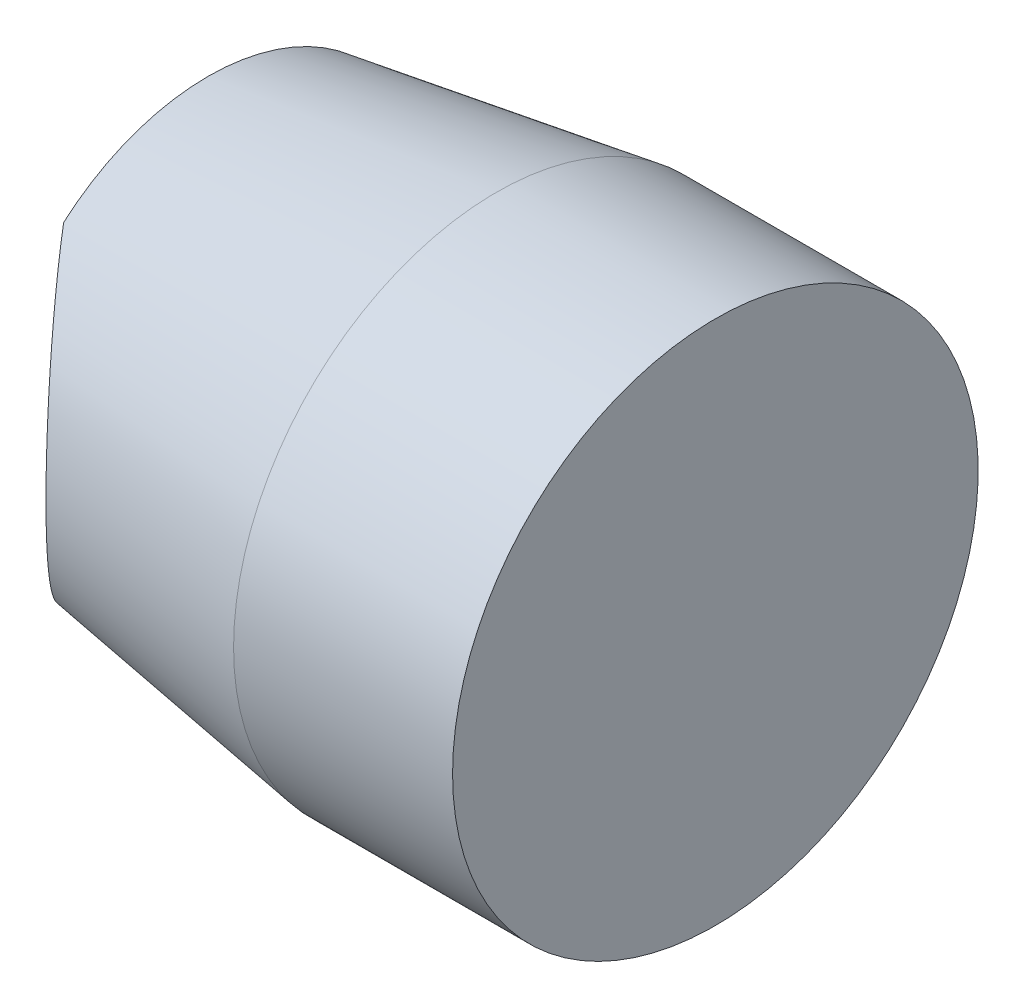
ISO-10303-21;
HEADER;
FILE_DESCRIPTION(('STEP AP214'),'2;1');
FILE_NAME('part.step','',(''),(''),'','','');
FILE_SCHEMA(('AUTOMOTIVE_DESIGN { 1 0 10303 214 1 1 1 1 }'));
ENDSEC;
DATA;
#1=APPLICATION_CONTEXT('core data for automotive mechanical design processes');
#2=APPLICATION_PROTOCOL_DEFINITION('international standard','automotive_design',2000,#1);
#3=PRODUCT_CONTEXT('',#1,'mechanical');
#4=PRODUCT('Part','Part','',(#3));
#5=PRODUCT_RELATED_PRODUCT_CATEGORY('part','',(#4));
#6=PRODUCT_DEFINITION_FORMATION('','',#4);
#7=PRODUCT_DEFINITION_CONTEXT('part definition',#1,'design');
#8=PRODUCT_DEFINITION('design','',#6,#7);
#9=PRODUCT_DEFINITION_SHAPE('','',#8);
#10=(LENGTH_UNIT() NAMED_UNIT(*) SI_UNIT(.MILLI.,.METRE.));
#11=(NAMED_UNIT(*) PLANE_ANGLE_UNIT() SI_UNIT($,.RADIAN.));
#12=(NAMED_UNIT(*) SI_UNIT($,.STERADIAN.) SOLID_ANGLE_UNIT());
#13=UNCERTAINTY_MEASURE_WITH_UNIT(LENGTH_MEASURE(1.E-05),#10,'distance_accuracy_value','');
#14=(GEOMETRIC_REPRESENTATION_CONTEXT(3) GLOBAL_UNCERTAINTY_ASSIGNED_CONTEXT((#13)) GLOBAL_UNIT_ASSIGNED_CONTEXT((#10,
#11,#12)) REPRESENTATION_CONTEXT('',''));
#15=CARTESIAN_POINT('',(0.,0.,0.));
#16=DIRECTION('',(0.,0.,1.));
#17=DIRECTION('',(1.,0.,0.));
#18=AXIS2_PLACEMENT_3D('',#15,#16,#17);
#19=CARTESIAN_POINT('',(0.,3.,0.));
#20=DIRECTION('',(1.,0.,0.));
#21=DIRECTION('',(0.,0.,-1.));
#22=AXIS2_PLACEMENT_3D('',#19,#20,#21);
#23=PLANE('',#22);
#24=CARTESIAN_POINT('',(0.,2.30271578793389,0.));
#25=CARTESIAN_POINT('',(0.,2.30271619018956,-0.256057420989866));
#26=CARTESIAN_POINT('',(0.,2.30041481848519,-0.512115486956815));
#27=CARTESIAN_POINT('',(0.,2.29111924963619,-1.02415480128034));
#28=CARTESIAN_POINT('',(0.,2.28412491334884,-1.28013604713413));
#29=CARTESIAN_POINT('',(0.,2.26515634263327,-1.79209873847997));
#30=CARTESIAN_POINT('',(0.,2.253178571374,-2.04808005473503));
#31=CARTESIAN_POINT('',(0.,2.22375143060397,-2.5597230435989));
#32=CARTESIAN_POINT('',(0.,2.20630226342632,-2.81538472767682));
#33=CARTESIAN_POINT('',(0.,2.16524643190168,-3.32543629194042));
#34=CARTESIAN_POINT('',(0.,2.14165868193388,-3.57982767413026));
#35=CARTESIAN_POINT('',(0.,2.08723238381336,-4.08783054496586));
#36=CARTESIAN_POINT('',(0.,2.05639433168584,-4.34144208576206));
#37=CARTESIAN_POINT('',(0.,1.98596835851503,-4.84715786518813));
#38=CARTESIAN_POINT('',(0.,1.94639075878595,-5.09926352451207));
#39=CARTESIAN_POINT('',(0.,1.85625347124165,-5.60147587977535));
#40=CARTESIAN_POINT('',(0.,1.80569793894974,-5.85158329507749));
#41=CARTESIAN_POINT('',(0.,1.7268048879287,-6.19068734125625));
#42=CARTESIAN_POINT('',(0.,1.70474160874452,-6.28114936187864));
#43=CARTESIAN_POINT('',(0.,1.65842518892863,-6.46151329243922));
#44=CARTESIAN_POINT('',(0.,1.63417190698073,-6.55141516583159));
#45=CARTESIAN_POINT('',(0.,1.55761053823987,-6.82052527713747));
#46=CARTESIAN_POINT('',(0.,1.50159393528638,-6.99872681524354));
#47=CARTESIAN_POINT('',(0.,1.4057193897648,-7.26818101742081));
#48=CARTESIAN_POINT('',(0.,1.37056144158468,-7.36111016036302));
#49=CARTESIAN_POINT('',(0.,1.29578812835875,-7.54514746566464));
#50=CARTESIAN_POINT('',(0.,1.25617413392555,-7.63625617786238));
#51=CARTESIAN_POINT('',(0.,1.17166272957867,-7.81562118473223));
#52=CARTESIAN_POINT('',(0.,1.12678436031493,-7.90388637202995));
#53=CARTESIAN_POINT('',(0.,1.03033462518166,-8.07664019329982));
#54=CARTESIAN_POINT('',(0.,0.978771037054321,-8.16113306485225));
#55=CARTESIAN_POINT('',(0.,0.885941912754167,-8.29664915808889));
#56=CARTESIAN_POINT('',(0.,0.84709792125466,-8.34932127970212));
#57=CARTESIAN_POINT('',(0.,0.764833982254394,-8.45113444955086));
#58=CARTESIAN_POINT('',(0.,0.721408353970244,-8.50027098403376));
#59=CARTESIAN_POINT('',(0.,0.628750007651179,-8.59375005583249));
#60=CARTESIAN_POINT('',(0.,0.57946639964579,-8.63804302692048));
#61=CARTESIAN_POINT('',(0.,0.474646326766768,-8.71854835575752));
#62=CARTESIAN_POINT('',(0.,0.419126230673049,-8.75478115605383));
#63=CARTESIAN_POINT('',(0.,0.321574321522042,-8.80503790469086));
#64=CARTESIAN_POINT('',(0.,0.281295684209852,-8.82243192409152));
#65=CARTESIAN_POINT('',(0.,0.198469720279116,-8.85055246719884));
#66=CARTESIAN_POINT('',(0.,0.155925377250438,-8.86128753498317));
#67=CARTESIAN_POINT('',(0.,0.0692672934627121,-8.8750354301983));
#68=CARTESIAN_POINT('',(0.,0.025144684355504,-8.87799394040268));
#69=CARTESIAN_POINT('',(0.,-0.0628867030327287,-8.8756600309061));
#70=CARTESIAN_POINT('',(0.,-0.106795434737063,-8.8703658880979));
#71=CARTESIAN_POINT('',(0.,-0.189453872023171,-8.85291423995703));
#72=CARTESIAN_POINT('',(0.,-0.228333011571382,-8.84134882624701));
#73=CARTESIAN_POINT('',(0.,-0.304013576985636,-8.81278219020494));
#74=CARTESIAN_POINT('',(0.,-0.340814064186539,-8.79577853483315));
#75=CARTESIAN_POINT('',(0.,-0.435724052160858,-8.74463976172805));
#76=CARTESIAN_POINT('',(0.,-0.49173488368535,-8.70663068469886));
#77=CARTESIAN_POINT('',(0.,-0.597384420222757,-8.62258351253169));
#78=CARTESIAN_POINT('',(0.,-0.647000923525924,-8.57651868587694));
#79=CARTESIAN_POINT('',(0.,-0.738420787686659,-8.48141943838558));
#80=CARTESIAN_POINT('',(0.,-0.780483190798535,-8.43262968793735));
#81=CARTESIAN_POINT('',(0.,-0.860363663787594,-8.33166006153359));
#82=CARTESIAN_POINT('',(0.,-0.898177557763886,-8.27947692834547));
#83=CARTESIAN_POINT('',(0.,-0.970265298966888,-8.1726008019032));
#84=CARTESIAN_POINT('',(0.,-1.00453235369548,-8.11790327231091));
#85=CARTESIAN_POINT('',(0.,-1.06997588681387,-8.0067365508432));
#86=CARTESIAN_POINT('',(0.,-1.1011536514987,-7.9502681093297));
#87=CARTESIAN_POINT('',(0.,-1.17871942577881,-7.80183009848809));
#88=CARTESIAN_POINT('',(0.,-1.22307166246294,-7.70879838397381));
#89=CARTESIAN_POINT('',(0.,-1.30642615604186,-7.52034871378631));
#90=CARTESIAN_POINT('',(0.,-1.3454254822028,-7.42492948447364));
#91=CARTESIAN_POINT('',(0.,-1.41906850582677,-7.23223917262614));
#92=CARTESIAN_POINT('',(0.,-1.45370425192824,-7.13496507099022));
#93=CARTESIAN_POINT('',(0.,-1.51924640991826,-6.93916248548734));
#94=CARTESIAN_POINT('',(0.,-1.55015216135109,-6.84063378287749));
#95=CARTESIAN_POINT('',(0.,-1.63845867239388,-6.54247188284159));
#96=CARTESIAN_POINT('',(0.,-1.69103038798245,-6.341401393893));
#97=CARTESIAN_POINT('',(0.,-1.76252778911013,-6.03826032449602));
#98=CARTESIAN_POINT('',(0.,-1.78512288550943,-5.93701496005578));
#99=CARTESIAN_POINT('',(0.,-1.82813198605774,-5.73406043139156));
#100=CARTESIAN_POINT('',(0.,-1.84854603196845,-5.63235127608693));
#101=CARTESIAN_POINT('',(0.,-1.9068058463016,-5.32703299721612));
#102=CARTESIAN_POINT('',(0.,-1.94175302379137,-5.12286990941627));
#103=CARTESIAN_POINT('',(0.,-2.00530126064684,-4.71354875654689));
#104=CARTESIAN_POINT('',(0.,-2.03390144215257,-4.50839055784738));
#105=CARTESIAN_POINT('',(0.,-2.08575961890146,-4.09729416459807));
#106=CARTESIAN_POINT('',(0.,-2.1090147538267,-3.89135561209155));
#107=CARTESIAN_POINT('',(0.,-2.15089621228305,-3.47902015363704));
#108=CARTESIAN_POINT('',(0.,-2.16952264070898,-3.27262325818288));
#109=CARTESIAN_POINT('',(0.,-2.21940195439557,-2.65200420600774));
#110=CARTESIAN_POINT('',(0.,-2.24454294069056,-2.23728632251772));
#111=CARTESIAN_POINT('',(0.,-2.28142740306044,-1.40725400885803));
#112=CARTESIAN_POINT('',(0.,-2.29316981067247,-0.991939533757277));
#113=CARTESIAN_POINT('',(0.,-2.3016197372805,-0.369267348183715));
#114=CARTESIAN_POINT('',(0.,-2.30291230270835,-0.16196276239538));
#115=CARTESIAN_POINT('',(0.,-2.3024710305298,0.252629882313115));
#116=CARTESIAN_POINT('',(0.,-2.30073738720339,0.459917941439896));
#117=CARTESIAN_POINT('',(0.,-2.29095752287499,1.08179520044146));
#118=CARTESIAN_POINT('',(0.,-2.27833132736208,1.49632166318861));
#119=CARTESIAN_POINT('',(0.,-2.23960090872179,2.32445014572915));
#120=CARTESIAN_POINT('',(0.,-2.21350733620163,2.73805263702833));
#121=CARTESIAN_POINT('',(0.,-2.16202951844811,3.35737616867643));
#122=CARTESIAN_POINT('',(0.,-2.14281682382819,3.56361444597708));
#123=CARTESIAN_POINT('',(0.,-2.09968033832001,3.97559397609276));
#124=CARTESIAN_POINT('',(0.,-2.07575679467123,4.1813352544184));
#125=CARTESIAN_POINT('',(0.,-2.02276922950357,4.58954739533259));
#126=CARTESIAN_POINT('',(0.,-1.99377317972838,4.79202699831362));
#127=CARTESIAN_POINT('',(0.,-1.92943633981791,5.19602664483702));
#128=CARTESIAN_POINT('',(0.,-1.89409445611595,5.39754651683657));
#129=CARTESIAN_POINT('',(0.,-1.81574891109572,5.79876514286587));
#130=CARTESIAN_POINT('',(0.,-1.77275781204449,5.99846632685503));
#131=CARTESIAN_POINT('',(0.,-1.67713009184717,6.39551924105181));
#132=CARTESIAN_POINT('',(0.,-1.62449797852452,6.59287202355924));
#133=CARTESIAN_POINT('',(0.,-1.54492452873739,6.85656335344364));
#134=CARTESIAN_POINT('',(0.,-1.52355197367489,6.92458932954281));
#135=CARTESIAN_POINT('',(0.,-1.47906175081979,7.06007099641875));
#136=CARTESIAN_POINT('',(0.,-1.45594394655084,7.12752664213677));
#137=CARTESIAN_POINT('',(0.,-1.38353872556474,7.32925136467965));
#138=CARTESIAN_POINT('',(0.,-1.33130965598138,7.46250472075917));
#139=CARTESIAN_POINT('',(0.,-1.24198272845094,7.66674464493482));
#140=CARTESIAN_POINT('',(0.,-1.20837736216438,7.73926169412236));
#141=CARTESIAN_POINT('',(0.,-1.13740084310569,7.88241962709404));
#142=CARTESIAN_POINT('',(0.,-1.10003098285226,7.95306114437709));
#143=CARTESIAN_POINT('',(0.,-1.02090992465701,8.09151760217561));
#144=CARTESIAN_POINT('',(0.,-0.979175730560581,8.15934217275296));
#145=CARTESIAN_POINT('',(0.,-0.890251463452173,8.29127566708565));
#146=CARTESIAN_POINT('',(0.,-0.843068018245905,8.35538896515575));
#147=CARTESIAN_POINT('',(0.,-0.755045799269324,8.46215935104652));
#148=CARTESIAN_POINT('',(0.,-0.715737177571885,8.50606740884148));
#149=CARTESIAN_POINT('',(0.,-0.632704545578179,8.58968335996891));
#150=CARTESIAN_POINT('',(0.,-0.588974950121212,8.62938580728426));
#151=CARTESIAN_POINT('',(0.,-0.495998697363988,8.70312099761332));
#152=CARTESIAN_POINT('',(0.,-0.446691541306113,8.73707910899359));
#153=CARTESIAN_POINT('',(0.,-0.342876817664349,8.79581530258852));
#154=CARTESIAN_POINT('',(0.,-0.288386761369271,8.82062300584898));
#155=CARTESIAN_POINT('',(0.,-0.192503788108303,8.85208446454662));
#156=CARTESIAN_POINT('',(0.,-0.152176340718685,8.86196610505212));
#157=CARTESIAN_POINT('',(0.,-0.0704317051299258,8.87476414709608));
#158=CARTESIAN_POINT('',(0.,-0.0290155178170578,8.87768673432845));
#159=CARTESIAN_POINT('',(0.,0.0537229626135532,8.87625323091297));
#160=CARTESIAN_POINT('',(0.,0.0950451431318834,8.87189082477117));
#161=CARTESIAN_POINT('',(0.,0.17638670554275,8.85634801479037));
#162=CARTESIAN_POINT('',(0.,0.216404816540665,8.84516115779466));
#163=CARTESIAN_POINT('',(0.,0.30689333045181,8.81241333859658));
#164=CARTESIAN_POINT('',(0.,0.356565965688615,8.78866889766332));
#165=CARTESIAN_POINT('',(0.,0.451507184584574,8.73362017494527));
#166=CARTESIAN_POINT('',(0.,0.496765469772759,8.70229878174129));
#167=CARTESIAN_POINT('',(0.,0.612713048969769,8.61090392671316));
#168=CARTESIAN_POINT('',(0.,0.679454832489103,8.54588313607115));
#169=CARTESIAN_POINT('',(0.,0.803085416460741,8.40717256810155));
#170=CARTESIAN_POINT('',(0.,0.859945900699665,8.33345886126733));
#171=CARTESIAN_POINT('',(0.,0.98631503516413,8.15146856801582));
#172=CARTESIAN_POINT('',(0.,1.0523081650411,8.04078083721444));
#173=CARTESIAN_POINT('',(0.,1.17368742348289,7.81365213824607));
#174=CARTESIAN_POINT('',(0.,1.22905109381456,7.69719962865867));
#175=CARTESIAN_POINT('',(0.,1.33189585938514,7.46015331640255));
#176=CARTESIAN_POINT('',(0.,1.37933253052256,7.3395404637223));
#177=CARTESIAN_POINT('',(0.,1.46764168179653,7.09611113719619));
#178=CARTESIAN_POINT('',(0.,1.50852068731415,6.97329699084475));
#179=CARTESIAN_POINT('',(0.,1.61487822130925,6.62957748985516));
#180=CARTESIAN_POINT('',(0.,1.67465938159899,6.40691503845951));
#181=CARTESIAN_POINT('',(0.,1.78206037868896,5.95863520057769));
#182=CARTESIAN_POINT('',(0.,1.82967262547771,5.73301606171055));
#183=CARTESIAN_POINT('',(0.,1.9154973103287,5.27952684179919));
#184=CARTESIAN_POINT('',(0.,1.95368975838205,5.0516530232704));
#185=CARTESIAN_POINT('',(0.,2.02240235756378,4.59474688328533));
#186=CARTESIAN_POINT('',(0.,2.05292167010774,4.3657144379925));
#187=CARTESIAN_POINT('',(0.,2.10755735583778,3.90705654637218));
#188=CARTESIAN_POINT('',(0.,2.13167812178194,3.67743161672352));
#189=CARTESIAN_POINT('',(0.,2.17447442712944,3.21766783595543));
#190=CARTESIAN_POINT('',(0.,2.19314964706602,2.98752895548248));
#191=CARTESIAN_POINT('',(0.,2.22570457347171,2.52718464100216));
#192=CARTESIAN_POINT('',(0.,2.23958982124239,2.29697959433125));
#193=CARTESIAN_POINT('',(0.,2.26306850731441,1.83635170891861));
#194=CARTESIAN_POINT('',(0.,2.27266191776965,1.60592886877352));
#195=CARTESIAN_POINT('',(0.,2.28782899789987,1.14629951757147));
#196=CARTESIAN_POINT('',(0.,2.29342581672636,0.917093762259857));
#197=CARTESIAN_POINT('',(0.,2.30086927779234,0.458592182283086));
#198=CARTESIAN_POINT('',(0.,2.30271542771876,0.229296349744708));
#199=CARTESIAN_POINT('',(0.,2.30271578793389,0.));
#200=B_SPLINE_CURVE_WITH_KNOTS('',3,(#24,#25,#26,#27,#28,#29,#30,#31,#32,#33,#34,#35,#36,#37,
#38,#39,#40,#41,#42,#43,#44,#45,#46,#47,#48,#49,#50,#51,#52,#53,#54,#55,#56,#57,#58,#59,#60,#61,
#62,#63,#64,#65,#66,#67,#68,#69,#70,#71,#72,#73,#74,#75,#76,#77,#78,#79,#80,#81,#82,#83,#84,#85,
#86,#87,#88,#89,#90,#91,#92,#93,#94,#95,#96,#97,#98,#99,#100,#101,#102,#103,#104,#105,#106,#107,
#108,#109,#110,#111,#112,#113,#114,#115,#116,#117,#118,#119,#120,#121,#122,#123,#124,#125,#126,
#127,#128,#129,#130,#131,#132,#133,#134,#135,#136,#137,#138,#139,#140,#141,#142,#143,#144,#145,
#146,#147,#148,#149,#150,#151,#152,#153,#154,#155,#156,#157,#158,#159,#160,#161,#162,#163,#164,
#165,#166,#167,#168,#169,#170,#171,#172,#173,#174,#175,#176,#177,#178,#179,#180,#181,#182,#183,
#184,#185,#186,#187,#188,#189,#190,#191,#192,#193,#194,#195,#196,#197,#198,#199),.UNSPECIFIED.,
.T.,.F.,(4,2,2,2,2,2,2,2,2,2,2,2,2,2,2,2,2,2,2,2,2,2,2,2,2,2,2,2,2,2,2,2,2,2,2,2,2,2,2,2,2,2,2,
2,2,2,2,2,2,2,2,2,2,2,2,2,2,2,2,2,2,2,2,2,2,2,2,2,2,2,2,2,2,2,2,2,2,2,2,2,2,2,2,2,2,2,2,4),(0.,
0.768162777638334,1.53634833170923,2.30508001304346,3.07378326990723,3.84014545581212,
4.60645522674255,5.37186478846892,6.13698511997906,6.4163009921842,6.69563490094226,
7.25556624394516,7.55355368307463,7.8514497151043,8.14829971355869,8.44480739786877,
8.64095731216252,8.83735335688242,9.03560105147041,9.23334005928364,9.36449587532189,
9.49548305578821,9.62738274585719,9.75930997952392,9.88052677215571,10.0017978725623,
10.2036926061374,10.4062704626149,10.599234673315,10.792386921108,10.985902481908,
11.1793371265712,11.4882896127895,11.7974105823384,12.1070869294942,12.4168180296452,
13.039911535577,13.3511073739033,13.6622972525352,14.2835598033516,14.904908228193,
15.5265883877439,16.1482544576183,17.3944024325485,18.6406497739719,19.2625564398833,
19.8844231813889,21.1283840527891,22.3713626480266,22.9927138206122,23.6140323915134,
24.2275868929556,24.8412472288481,25.4539089026205,26.066284843631,26.2801765866915,
26.4940850731836,26.9230689947348,27.162762966432,27.4023749191951,27.6410858438768,
27.8795094281005,28.0560719580124,28.2328604006605,28.411793724899,28.5901426270652,
28.7141734861787,28.8380940567559,28.9621221121203,29.0862676297962,29.2505025419247,
29.4151118747224,29.6930675532079,29.9718070678961,30.3574746211609,30.743948266951,
31.1325199784088,31.5207025999954,32.2118084223996,32.9033442560854,33.5963352281616,
34.2894019031967,34.9819915324139,35.6746217847144,36.3664480560729,37.0582788160413,
37.7460690977029,38.4339496529366),.UNSPECIFIED.);
#201=CARTESIAN_POINT('',(-1.1433992165525E-11,-2.25575357307668,-1.97777041578171));
#202=VERTEX_POINT('',#201);
#203=CARTESIAN_POINT('',(0.,-2.25575357306466,1.97777041581523));
#204=VERTEX_POINT('',#203);
#205=EDGE_CURVE('E70',#202,#204,#200,.T.);
#206=ORIENTED_EDGE('',*,*,#205,.F.);
#207=CARTESIAN_POINT('',(0.,0.,0.));
#208=DIRECTION('',(-1.,0.,0.));
#209=DIRECTION('',(0.,0.,1.));
#210=AXIS2_PLACEMENT_3D('',#207,#208,#209);
#211=CIRCLE('',#210,3.);
#212=EDGE_CURVE('E84',#202,#204,#211,.T.);
#213=ORIENTED_EDGE('',*,*,#212,.T.);
#214=EDGE_LOOP('',(#206,#213));
#215=FACE_BOUND('',#214,.T.);
#216=ADVANCED_FACE('F42',(#215),#23,.F.);
#217=CARTESIAN_POINT('',(0.,2.25575357306555,1.97777041579692));
#218=VERTEX_POINT('',#217);
#219=CARTESIAN_POINT('',(0.,2.25575357306554,-1.97777041579706));
#220=VERTEX_POINT('',#219);
#221=EDGE_CURVE('E63',#218,#220,#200,.T.);
#222=ORIENTED_EDGE('',*,*,#221,.F.);
#223=EDGE_CURVE('E89',#218,#220,#211,.T.);
#224=ORIENTED_EDGE('',*,*,#223,.T.);
#225=EDGE_LOOP('',(#222,#224));
#226=FACE_BOUND('',#225,.T.);
#227=ADVANCED_FACE('F120',(#226),#23,.F.);
#228=CARTESIAN_POINT('',(3.95,0.,0.));
#229=DIRECTION('',(1.,0.,0.));
#230=DIRECTION('',(0.,0.,-1.));
#231=AXIS2_PLACEMENT_3D('',#228,#229,#230);
#232=CONICAL_SURFACE('',#231,3.6,0.150746381120422);
#233=CARTESIAN_POINT('',(3.95,0.,0.));
#234=DIRECTION('',(-1.,0.,0.));
#235=DIRECTION('',(0.,0.,1.));
#236=AXIS2_PLACEMENT_3D('',#233,#234,#235);
#237=CIRCLE('',#236,3.6);
#238=CARTESIAN_POINT('',(3.95,0.,3.6));
#239=VERTEX_POINT('',#238);
#240=EDGE_CURVE('E93',#239,#239,#237,.T.);
#241=ORIENTED_EDGE('',*,*,#240,.T.);
#242=EDGE_LOOP('',(#241));
#243=FACE_BOUND('',#242,.T.);
#244=CARTESIAN_POINT('',(-0.545610889147609,-2.67057044931373,1.17373615089215));
#245=CARTESIAN_POINT('',(-0.502803108813773,-2.64569966593585,1.24641302995476));
#246=CARTESIAN_POINT('',(-0.458722948137358,-2.61850442403317,1.31751277000916));
#247=CARTESIAN_POINT('',(-0.369035883915507,-2.55938889644057,1.45672657748777));
#248=CARTESIAN_POINT('',(-0.323428976447891,-2.52746859861136,1.5248406372408));
#249=CARTESIAN_POINT('',(-0.231357229603584,-2.45856545329473,1.65875957653372));
#250=CARTESIAN_POINT('',(-0.184888501011268,-2.42154588507832,1.7245429069225));
#251=CARTESIAN_POINT('',(-0.0921990777257676,-2.34252543320335,1.85321127113476));
#252=CARTESIAN_POINT('',(-0.0459783917505551,-2.30052437564308,1.91609620366992));
#253=CARTESIAN_POINT('',(0.0958622044928516,-2.16240915564013,2.10635757089889));
#254=CARTESIAN_POINT('',(0.18997682899668,-2.05753139173722,2.22870056617786));
#255=CARTESIAN_POINT('',(0.368249884253227,-1.82448165870408,2.45688291391883));
#256=CARTESIAN_POINT('',(0.452437517429607,-1.69638097696711,2.56277097994706));
#257=CARTESIAN_POINT('',(0.587156270548502,-1.44998452044558,2.73079615572037));
#258=CARTESIAN_POINT('',(0.640942468029903,-1.33650067704264,2.7973620293662));
#259=CARTESIAN_POINT('',(0.736503908371695,-1.0969413283267,2.91516163052352));
#260=CARTESIAN_POINT('',(0.778282591632269,-0.970869443724066,2.96639974992455));
#261=CARTESIAN_POINT('',(0.829876786481205,-0.77390830255137,3.02954303670104));
#262=CARTESIAN_POINT('',(0.845275542620623,-0.706607024436623,3.04836132989053));
#263=CARTESIAN_POINT('',(0.871963837686773,-0.570010271370193,3.0809491564713));
#264=CARTESIAN_POINT('',(0.883255489939714,-0.500715841866394,3.09472128641232));
#265=CARTESIAN_POINT('',(0.901469446075214,-0.360737087188058,3.11692601434145));
#266=CARTESIAN_POINT('',(0.908393685901765,-0.290053392181442,3.12536097814178));
#267=CARTESIAN_POINT('',(0.917722093815138,-0.147973788290901,3.13672258482315));
#268=CARTESIAN_POINT('',(0.920126891824431,-0.0765779800565048,3.13964999535028));
#269=CARTESIAN_POINT('',(0.920413007689851,0.118599076630239,3.1399992014675));
#270=CARTESIAN_POINT('',(0.913694776379617,0.242472090451541,3.13182253747278));
#271=CARTESIAN_POINT('',(0.886924348076632,0.486454040652434,3.09919796974569));
#272=CARTESIAN_POINT('',(0.866873962858767,0.606563486160643,3.07475227689483));
#273=CARTESIAN_POINT('',(0.81520373752643,0.838288434684297,3.01160581410382));
#274=CARTESIAN_POINT('',(0.783761141518193,0.950003996543325,2.97312337425642));
#275=CARTESIAN_POINT('',(0.711011975573178,1.16495478006154,2.88376596576031));
#276=CARTESIAN_POINT('',(0.669696355563081,1.26818210363047,2.83287962625677));
#277=CARTESIAN_POINT('',(0.560071273732403,1.50623977849673,2.69715846501101));
#278=CARTESIAN_POINT('',(0.487705130998386,1.63618675154774,2.60703325881913));
#279=CARTESIAN_POINT('',(0.332049566542625,1.87545195765728,2.4107486343961));
#280=CARTESIAN_POINT('',(0.248761609071415,1.98477295118781,2.30459136524023));
#281=CARTESIAN_POINT('',(0.135812001257767,2.11452034244966,2.15757222126995));
#282=CARTESIAN_POINT('',(0.108925094597979,2.14411136176039,2.12236154811415));
#283=CARTESIAN_POINT('',(0.0546816329969175,2.20142511376235,2.05078477370333));
#284=CARTESIAN_POINT('',(0.0273250443679917,2.22914771173386,2.01441858940951));
#285=CARTESIAN_POINT('',(-0.0573639719746663,2.31160782020116,1.90083421547522));
#286=CARTESIAN_POINT('',(-0.115254509080531,2.36329073265159,1.82179305848447));
#287=CARTESIAN_POINT('',(-0.231197403932565,2.45895944738774,1.65917884427957));
#288=CARTESIAN_POINT('',(-0.289249864242285,2.50293772432165,1.57560145958115));
#289=CARTESIAN_POINT('',(-0.403767855186071,2.58330559544734,1.40399384530779));
#290=CARTESIAN_POINT('',(-0.460235146492306,2.61970392276178,1.31596888693304));
#291=CARTESIAN_POINT('',(-0.569345218412312,2.68505262421899,1.1350131547946));
#292=CARTESIAN_POINT('',(-0.621992734949701,2.71401233835736,1.04208871142006));
#293=CARTESIAN_POINT('',(-0.697864147994482,2.75304572872195,0.893797514835816));
#294=CARTESIAN_POINT('',(-0.723635820828495,2.76574107371353,0.84042827566491));
#295=CARTESIAN_POINT('',(-0.772121696912091,2.78881611331405,0.731854105530617));
#296=CARTESIAN_POINT('',(-0.794836468116664,2.79919623831398,0.676649517947995));
#297=CARTESIAN_POINT('',(-0.815593957363158,2.80838992900986,0.620457917948785));
#298=B_SPLINE_CURVE_WITH_KNOTS('',3,(#244,#245,#246,#247,#248,#249,#250,#251,#252,#253,#254,
#255,#256,#257,#258,#259,#260,#261,#262,#263,#264,#265,#266,#267,#268,#269,#270,#271,#272,#273,
#274,#275,#276,#277,#278,#279,#280,#281,#282,#283,#284,#285,#286,#287,#288,#289,#290,#291,#292,
#293,#294,#295,#296,#297),.UNSPECIFIED.,.F.,.F.,(4,2,2,2,2,2,2,2,2,2,2,2,2,2,2,2,2,2,2,2,2,2,2,
2,2,2,4),(0.,0.26371972289796,0.527440123338272,0.793169931087007,1.05890901808333,
1.61654072030406,2.17248878573669,2.59732979246079,3.02204895185715,3.23645519886422,
3.45075096571203,3.66495167474106,3.87912252613384,4.25006146739332,4.62095001015392,
4.98629988195101,5.35198594382299,5.87091014854623,6.38976485385845,6.54956752645344,
6.70938170908067,7.04128357033203,7.37350782445372,7.70534716758138,8.036767790435,
8.21846657407667,8.40013155237051),.UNSPECIFIED.);
#299=EDGE_CURVE('E11',#204,#218,#298,.T.);
#300=ORIENTED_EDGE('',*,*,#299,.F.);
#301=ORIENTED_EDGE('',*,*,#212,.F.);
#302=CARTESIAN_POINT('',(-0.545610889147609,2.67057044931373,-1.17373615089215));
#303=CARTESIAN_POINT('',(-0.502803108813775,2.64569966593585,-1.24641302995476));
#304=CARTESIAN_POINT('',(-0.45872294813736,2.61850442403317,-1.31751277000916));
#305=CARTESIAN_POINT('',(-0.369035883915509,2.55938889644056,-1.45672657748777));
#306=CARTESIAN_POINT('',(-0.323428976447891,2.52746859861136,-1.5248406372408));
#307=CARTESIAN_POINT('',(-0.23135722960358,2.45856545329472,-1.65875957653372));
#308=CARTESIAN_POINT('',(-0.184888501011263,2.42154588507832,-1.7245429069225));
#309=CARTESIAN_POINT('',(-0.0921990777257619,2.34252543320334,-1.85321127113476));
#310=CARTESIAN_POINT('',(-0.0459783917505506,2.30052437564307,-1.91609620366993));
#311=CARTESIAN_POINT('',(0.0958622044928544,2.16240915564012,-2.10635757089889));
#312=CARTESIAN_POINT('',(0.189976828996686,2.05753139173722,-2.22870056617786));
#313=CARTESIAN_POINT('',(0.368249884253233,1.82448165870408,-2.45688291391883));
#314=CARTESIAN_POINT('',(0.452437517429609,1.6963809769671,-2.56277097994707));
#315=CARTESIAN_POINT('',(0.5871562705485,1.44998452044557,-2.73079615572038));
#316=CARTESIAN_POINT('',(0.6409424680299,1.33650067704263,-2.79736202936621));
#317=CARTESIAN_POINT('',(0.736503908371696,1.0969413283267,-2.91516163052352));
#318=CARTESIAN_POINT('',(0.778282591632273,0.970869443724063,-2.96639974992455));
#319=CARTESIAN_POINT('',(0.829876786481207,0.773908302551366,-3.02954303670104));
#320=CARTESIAN_POINT('',(0.845275542620623,0.70660702443662,-3.04836132989053));
#321=CARTESIAN_POINT('',(0.871963837686769,0.570010271370189,-3.0809491564713));
#322=CARTESIAN_POINT('',(0.883255489939709,0.500715841866389,-3.09472128641232));
#323=CARTESIAN_POINT('',(0.901469446075216,0.360737087188054,-3.11692601434145));
#324=CARTESIAN_POINT('',(0.908393685901775,0.290053392181438,-3.12536097814178));
#325=CARTESIAN_POINT('',(0.917722093815146,0.147973788290897,-3.13672258482316));
#326=CARTESIAN_POINT('',(0.92012689182443,0.0765779800565002,-3.13964999535028));
#327=CARTESIAN_POINT('',(0.920413007689837,-0.118599076630244,-3.1399992014675));
#328=CARTESIAN_POINT('',(0.913694776379611,-0.242472090451546,-3.13182253747278));
#329=CARTESIAN_POINT('',(0.886924348076634,-0.486454040652438,-3.09919796974569));
#330=CARTESIAN_POINT('',(0.866873962858771,-0.606563486160648,-3.07475227689483));
#331=CARTESIAN_POINT('',(0.815203737526433,-0.838288434684301,-3.01160581410382));
#332=CARTESIAN_POINT('',(0.783761141518195,-0.950003996543328,-2.97312337425642));
#333=CARTESIAN_POINT('',(0.711011975573178,-1.16495478006155,-2.8837659657603));
#334=CARTESIAN_POINT('',(0.669696355563079,-1.26818210363047,-2.83287962625677));
#335=CARTESIAN_POINT('',(0.560071273732401,-1.50623977849673,-2.697158465011));
#336=CARTESIAN_POINT('',(0.487705130998386,-1.63618675154774,-2.60703325881912));
#337=CARTESIAN_POINT('',(0.332049566542626,-1.87545195765729,-2.4107486343961));
#338=CARTESIAN_POINT('',(0.248761609071412,-1.98477295118781,-2.30459136524023));
#339=CARTESIAN_POINT('',(0.135812001257767,-2.11452034244966,-2.15757222126995));
#340=CARTESIAN_POINT('',(0.108925094597981,-2.14411136176039,-2.12236154811415));
#341=CARTESIAN_POINT('',(0.0546816329969211,-2.20142511376235,-2.05078477370334));
#342=CARTESIAN_POINT('',(0.0273250443679953,-2.22914771173386,-2.01441858940952));
#343=CARTESIAN_POINT('',(-0.0573639719746627,-2.31160782020116,-1.90083421547522));
#344=CARTESIAN_POINT('',(-0.115254509080526,-2.36329073265159,-1.82179305848448));
#345=CARTESIAN_POINT('',(-0.231197403932559,-2.45895944738773,-1.65917884427958));
#346=CARTESIAN_POINT('',(-0.289249864242282,-2.50293772432165,-1.57560145958116));
#347=CARTESIAN_POINT('',(-0.403767855186068,-2.58330559544734,-1.4039938453078));
#348=CARTESIAN_POINT('',(-0.4602351464923,-2.61970392276178,-1.31596888693305));
#349=CARTESIAN_POINT('',(-0.569345218412308,-2.68505262421898,-1.13501315479461));
#350=CARTESIAN_POINT('',(-0.621992734949702,-2.71401233835736,-1.04208871142007));
#351=CARTESIAN_POINT('',(-0.697864147994482,-2.75304572872195,-0.893797514835823));
#352=CARTESIAN_POINT('',(-0.723635820828494,-2.76574107371353,-0.840428275664915));
#353=CARTESIAN_POINT('',(-0.772121696912088,-2.78881611331405,-0.731854105530619));
#354=CARTESIAN_POINT('',(-0.794836468116661,-2.79919623831398,-0.676649517947996));
#355=CARTESIAN_POINT('',(-0.815593957363158,-2.80838992900986,-0.620457917948785));
#356=B_SPLINE_CURVE_WITH_KNOTS('',3,(#302,#303,#304,#305,#306,#307,#308,#309,#310,#311,#312,
#313,#314,#315,#316,#317,#318,#319,#320,#321,#322,#323,#324,#325,#326,#327,#328,#329,#330,#331,
#332,#333,#334,#335,#336,#337,#338,#339,#340,#341,#342,#343,#344,#345,#346,#347,#348,#349,#350,
#351,#352,#353,#354,#355),.UNSPECIFIED.,.F.,.F.,(4,2,2,2,2,2,2,2,2,2,2,2,2,2,2,2,2,2,2,2,2,2,2,
2,2,2,4),(0.,0.263719722897962,0.527440123338277,0.793169931087013,1.05890901808334,
1.61654072030406,2.1724887857367,2.5973297924608,3.02204895185716,3.23645519886422,
3.45075096571203,3.66495167474106,3.87912252613385,4.25006146739333,4.62095001015392,
4.98629988195101,5.351985943823,5.87091014854624,6.38976485385846,6.54956752645344,
6.70938170908066,7.04128357033203,7.37350782445372,7.70534716758138,8.03676779043499,
8.21846657407667,8.40013155237052),.UNSPECIFIED.);
#357=EDGE_CURVE('E57',#220,#202,#356,.T.);
#358=ORIENTED_EDGE('',*,*,#357,.F.);
#359=ORIENTED_EDGE('',*,*,#223,.F.);
#360=EDGE_LOOP('',(#300,#301,#358,#359));
#361=FACE_BOUND('',#360,.T.);
#362=ADVANCED_FACE('F87',(#243,#361),#232,.T.);
#363=CARTESIAN_POINT('',(6.95,0.,0.));
#364=DIRECTION('',(-1.,0.,0.));
#365=DIRECTION('',(0.,0.,1.));
#366=AXIS2_PLACEMENT_3D('',#363,#364,#365);
#367=PLANE('',#366);
#368=CARTESIAN_POINT('',(6.95,0.,0.));
#369=DIRECTION('',(-1.,0.,0.));
#370=DIRECTION('',(0.,0.,1.));
#371=AXIS2_PLACEMENT_3D('',#368,#369,#370);
#372=CIRCLE('',#371,3.6);
#373=CARTESIAN_POINT('',(6.95,0.,3.6));
#374=VERTEX_POINT('',#373);
#375=EDGE_CURVE('E81',#374,#374,#372,.T.);
#376=ORIENTED_EDGE('',*,*,#375,.F.);
#377=EDGE_LOOP('',(#376));
#378=FACE_BOUND('',#377,.T.);
#379=ADVANCED_FACE('F117',(#378),#367,.F.);
#380=CARTESIAN_POINT('',(0.,0.,0.));
#381=DIRECTION('',(-1.,0.,0.));
#382=DIRECTION('',(0.,0.,1.));
#383=AXIS2_PLACEMENT_3D('',#380,#381,#382);
#384=CYLINDRICAL_SURFACE('',#383,3.6);
#385=ORIENTED_EDGE('',*,*,#240,.F.);
#386=EDGE_LOOP('',(#385));
#387=FACE_BOUND('',#386,.T.);
#388=ORIENTED_EDGE('',*,*,#375,.T.);
#389=EDGE_LOOP('',(#388));
#390=FACE_BOUND('',#389,.T.);
#391=ADVANCED_FACE('F111',(#387,#390),#384,.T.);
#392=CARTESIAN_POINT('',(-37.,0.,0.));
#393=DIRECTION('',(0.,1.,0.));
#394=DIRECTION('',(0.,0.,1.));
#395=AXIS2_PLACEMENT_3D('',#392,#393,#394);
#396=TOROIDAL_SURFACE('',#395,35.,3.05);
#397=ORIENTED_EDGE('',*,*,#299,.T.);
#398=ORIENTED_EDGE('',*,*,#221,.T.);
#399=ORIENTED_EDGE('',*,*,#357,.T.);
#400=ORIENTED_EDGE('',*,*,#205,.T.);
#401=EDGE_LOOP('',(#397,#398,#399,#400));
#402=FACE_BOUND('',#401,.T.);
#403=ADVANCED_FACE('F75',(#402),#396,.F.);
#404=CLOSED_SHELL('',(#216,#227,#362,#379,#391,#403));
#405=MANIFOLD_SOLID_BREP('B2',#404);
#406=ADVANCED_BREP_SHAPE_REPRESENTATION('',(#18,#405),#14);
#407=SHAPE_DEFINITION_REPRESENTATION(#9,#406);
ENDSEC;
END-ISO-10303-21;
